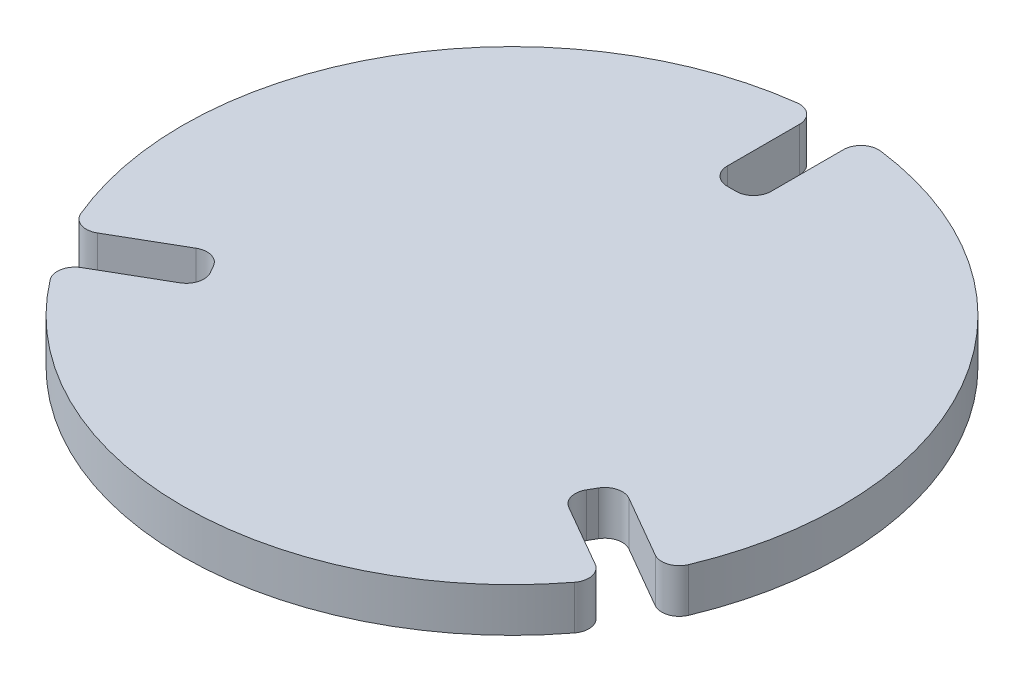
ISO-10303-21;
HEADER;
FILE_DESCRIPTION(('STEP AP214'),'2;1');
FILE_NAME('part.step','',(''),(''),'','','');
FILE_SCHEMA(('AUTOMOTIVE_DESIGN { 1 0 10303 214 1 1 1 1 }'));
ENDSEC;
DATA;
#1=APPLICATION_CONTEXT('core data for automotive mechanical design processes');
#2=APPLICATION_PROTOCOL_DEFINITION('international standard','automotive_design',2000,#1);
#3=PRODUCT_CONTEXT('',#1,'mechanical');
#4=PRODUCT('Part','Part','',(#3));
#5=PRODUCT_RELATED_PRODUCT_CATEGORY('part','',(#4));
#6=PRODUCT_DEFINITION_FORMATION('','',#4);
#7=PRODUCT_DEFINITION_CONTEXT('part definition',#1,'design');
#8=PRODUCT_DEFINITION('design','',#6,#7);
#9=PRODUCT_DEFINITION_SHAPE('','',#8);
#10=(LENGTH_UNIT() NAMED_UNIT(*) SI_UNIT(.MILLI.,.METRE.));
#11=(NAMED_UNIT(*) PLANE_ANGLE_UNIT() SI_UNIT($,.RADIAN.));
#12=(NAMED_UNIT(*) SI_UNIT($,.STERADIAN.) SOLID_ANGLE_UNIT());
#13=UNCERTAINTY_MEASURE_WITH_UNIT(LENGTH_MEASURE(1.E-05),#10,'distance_accuracy_value','');
#14=(GEOMETRIC_REPRESENTATION_CONTEXT(3) GLOBAL_UNCERTAINTY_ASSIGNED_CONTEXT((#13)) GLOBAL_UNIT_ASSIGNED_CONTEXT((#10,
#11,#12)) REPRESENTATION_CONTEXT('',''));
#15=CARTESIAN_POINT('',(0.,0.,0.));
#16=DIRECTION('',(0.,0.,1.));
#17=DIRECTION('',(1.,0.,0.));
#18=AXIS2_PLACEMENT_3D('',#15,#16,#17);
#19=CARTESIAN_POINT('',(1.25,-5.,2.1650635094611));
#20=DIRECTION('',(0.500000000000001,0.,0.866025403784438));
#21=DIRECTION('',(0.866025403784438,0.,-0.500000000000001));
#22=AXIS2_PLACEMENT_3D('',#19,#20,#21);
#23=PLANE('',#22);
#24=DIRECTION('',(0.866025403784438,0.,-0.500000000000001));
#25=VECTOR('',#24,1.);
#26=CARTESIAN_POINT('',(1.25,0.,2.1650635094611));
#27=LINE('',#26,#25);
#28=CARTESIAN_POINT('',(-29.2459013639538,0.,19.7718803711201));
#29=VERTEX_POINT('',#28);
#30=CARTESIAN_POINT('',(-22.1326859021798,0.,15.6650635094611));
#31=VERTEX_POINT('',#30);
#32=EDGE_CURVE('E353',#29,#31,#27,.T.);
#33=ORIENTED_EDGE('',*,*,#32,.T.);
#34=DIRECTION('',(0.,1.,0.));
#35=VECTOR('',#34,1.);
#36=CARTESIAN_POINT('',(-22.1326859021798,-5.,15.6650635094611));
#37=LINE('',#36,#35);
#38=CARTESIAN_POINT('',(-22.1326859021798,-5.,15.6650635094611));
#39=VERTEX_POINT('',#38);
#40=EDGE_CURVE('E297',#31,#39,#37,.F.);
#41=ORIENTED_EDGE('',*,*,#40,.T.);
#42=DIRECTION('',(0.866025403784438,0.,-0.500000000000001));
#43=VECTOR('',#42,1.);
#44=CARTESIAN_POINT('',(1.25,-5.,2.1650635094611));
#45=LINE('',#44,#43);
#46=CARTESIAN_POINT('',(-29.2459013639538,-5.,19.7718803711201));
#47=VERTEX_POINT('',#46);
#48=EDGE_CURVE('E335',#47,#39,#45,.T.);
#49=ORIENTED_EDGE('',*,*,#48,.F.);
#50=DIRECTION('',(0.,-1.,0.));
#51=VECTOR('',#50,1.);
#52=CARTESIAN_POINT('',(-29.2459013639538,0.,19.7718803711201));
#53=LINE('',#52,#51);
#54=EDGE_CURVE('E294',#47,#29,#53,.F.);
#55=ORIENTED_EDGE('',*,*,#54,.T.);
#56=EDGE_LOOP('',(#33,#41,#49,#55));
#57=FACE_BOUND('',#56,.T.);
#58=ADVANCED_FACE('F35',(#57),#23,.F.);
#59=CARTESIAN_POINT('',(-21.650635094611,-5.,12.5));
#60=DIRECTION('',(0.866025403784439,0.,-0.5));
#61=DIRECTION('',(-0.5,0.,-0.866025403784439));
#62=AXIS2_PLACEMENT_3D('',#59,#60,#61);
#63=PLANE('',#62);
#64=DIRECTION('',(-0.5,0.,-0.866025403784439));
#65=VECTOR('',#64,1.);
#66=CARTESIAN_POINT('',(-21.650635094611,-5.,12.5));
#67=LINE('',#66,#65);
#68=CARTESIAN_POINT('',(-21.400635094611,-5.,12.9330127018922));
#69=VERTEX_POINT('',#68);
#70=CARTESIAN_POINT('',(-21.900635094611,-5.,12.0669872981078));
#71=VERTEX_POINT('',#70);
#72=EDGE_CURVE('E223',#69,#71,#67,.T.);
#73=ORIENTED_EDGE('',*,*,#72,.F.);
#74=DIRECTION('',(0.,1.,0.));
#75=VECTOR('',#74,1.);
#76=CARTESIAN_POINT('',(-21.400635094611,0.,12.9330127018922));
#77=LINE('',#76,#75);
#78=CARTESIAN_POINT('',(-21.400635094611,0.,12.9330127018922));
#79=VERTEX_POINT('',#78);
#80=EDGE_CURVE('E291',#69,#79,#77,.T.);
#81=ORIENTED_EDGE('',*,*,#80,.T.);
#82=DIRECTION('',(-0.5,0.,-0.866025403784439));
#83=VECTOR('',#82,1.);
#84=CARTESIAN_POINT('',(-21.650635094611,0.,12.5));
#85=LINE('',#84,#83);
#86=CARTESIAN_POINT('',(-21.900635094611,0.,12.0669872981078));
#87=VERTEX_POINT('',#86);
#88=EDGE_CURVE('E231',#79,#87,#85,.T.);
#89=ORIENTED_EDGE('',*,*,#88,.T.);
#90=DIRECTION('',(0.,1.,0.));
#91=VECTOR('',#90,1.);
#92=CARTESIAN_POINT('',(-21.900635094611,-5.,12.0669872981078));
#93=LINE('',#92,#91);
#94=EDGE_CURVE('E289',#87,#71,#93,.F.);
#95=ORIENTED_EDGE('',*,*,#94,.T.);
#96=EDGE_LOOP('',(#73,#81,#89,#95));
#97=FACE_BOUND('',#96,.T.);
#98=ADVANCED_FACE('F333',(#97),#63,.F.);
#99=CARTESIAN_POINT('',(-1.25,-5.,-2.1650635094611));
#100=DIRECTION('',(0.5,0.,0.866025403784438));
#101=DIRECTION('',(0.866025403784438,0.,-0.5));
#102=AXIS2_PLACEMENT_3D('',#99,#100,#101);
#103=PLANE('',#102);
#104=DIRECTION('',(0.866025403784438,0.,-0.5));
#105=VECTOR('',#104,1.);
#106=CARTESIAN_POINT('',(-1.25,-5.,-2.1650635094611));
#107=LINE('',#106,#105);
#108=CARTESIAN_POINT('',(-31.7459013639538,-5.,15.4417533521979));
#109=VERTEX_POINT('',#108);
#110=CARTESIAN_POINT('',(-24.6326859021798,-5.,11.3349364905389));
#111=VERTEX_POINT('',#110);
#112=EDGE_CURVE('E228',#109,#111,#107,.T.);
#113=ORIENTED_EDGE('',*,*,#112,.T.);
#114=DIRECTION('',(0.,1.,0.));
#115=VECTOR('',#114,1.);
#116=CARTESIAN_POINT('',(-24.6326859021799,-5.,11.3349364905389));
#117=LINE('',#116,#115);
#118=CARTESIAN_POINT('',(-24.6326859021798,0.,11.3349364905389));
#119=VERTEX_POINT('',#118);
#120=EDGE_CURVE('E301',#111,#119,#117,.T.);
#121=ORIENTED_EDGE('',*,*,#120,.T.);
#122=DIRECTION('',(0.866025403784438,0.,-0.5));
#123=VECTOR('',#122,1.);
#124=CARTESIAN_POINT('',(-1.25,0.,-2.1650635094611));
#125=LINE('',#124,#123);
#126=CARTESIAN_POINT('',(-31.7459013639538,0.,15.4417533521979));
#127=VERTEX_POINT('',#126);
#128=EDGE_CURVE('E327',#127,#119,#125,.T.);
#129=ORIENTED_EDGE('',*,*,#128,.F.);
#130=DIRECTION('',(0.,1.,0.));
#131=VECTOR('',#130,1.);
#132=CARTESIAN_POINT('',(-31.7459013639538,-5.,15.4417533521979));
#133=LINE('',#132,#131);
#134=EDGE_CURVE('E299',#127,#109,#133,.F.);
#135=ORIENTED_EDGE('',*,*,#134,.T.);
#136=EDGE_LOOP('',(#113,#121,#129,#135));
#137=FACE_BOUND('',#136,.T.);
#138=ADVANCED_FACE('F344',(#137),#103,.T.);
#139=CARTESIAN_POINT('',(0.,-5.,0.));
#140=DIRECTION('',(0.,1.,0.));
#141=DIRECTION('',(0.,0.,1.));
#142=AXIS2_PLACEMENT_3D('',#139,#140,#141);
#143=CYLINDRICAL_SURFACE('',#142,37.5);
#144=CARTESIAN_POINT('',(0.,0.,0.));
#145=DIRECTION('',(0.,1.,0.));
#146=DIRECTION('',(0.,0.,1.));
#147=AXIS2_PLACEMENT_3D('',#144,#145,#146);
#148=CIRCLE('',#147,37.5);
#149=CARTESIAN_POINT('',(-4.75352112676057,0.,-37.1975004119557));
#150=VERTEX_POINT('',#149);
#151=CARTESIAN_POINT('',(-34.590740877416,0.,14.4820801527772));
#152=VERTEX_POINT('',#151);
#153=EDGE_CURVE('E374',#150,#152,#148,.T.);
#154=ORIENTED_EDGE('',*,*,#153,.F.);
#155=DIRECTION('',(0.,1.,0.));
#156=VECTOR('',#155,1.);
#157=CARTESIAN_POINT('',(-4.75352112676057,-5.,-37.1975004119557));
#158=LINE('',#157,#156);
#159=CARTESIAN_POINT('',(-4.75352112676057,-5.,-37.1975004119557));
#160=VERTEX_POINT('',#159);
#161=EDGE_CURVE('E264',#150,#160,#158,.F.);
#162=ORIENTED_EDGE('',*,*,#161,.T.);
#163=CARTESIAN_POINT('',(0.,-5.,0.));
#164=DIRECTION('',(0.,1.,0.));
#165=DIRECTION('',(0.,0.,1.));
#166=AXIS2_PLACEMENT_3D('',#163,#164,#165);
#167=CIRCLE('',#166,37.5);
#168=CARTESIAN_POINT('',(-34.590740877416,-5.,14.4820801527772));
#169=VERTEX_POINT('',#168);
#170=EDGE_CURVE('E346',#160,#169,#167,.T.);
#171=ORIENTED_EDGE('',*,*,#170,.T.);
#172=DIRECTION('',(0.,1.,0.));
#173=VECTOR('',#172,1.);
#174=CARTESIAN_POINT('',(-34.590740877416,-5.,14.4820801527772));
#175=LINE('',#174,#173);
#176=EDGE_CURVE('E261',#169,#152,#175,.T.);
#177=ORIENTED_EDGE('',*,*,#176,.T.);
#178=EDGE_LOOP('',(#154,#162,#171,#177));
#179=FACE_BOUND('',#178,.T.);
#180=ADVANCED_FACE('F380',(#179),#143,.T.);
#181=CARTESIAN_POINT('',(-2.5,-5.,0.));
#182=DIRECTION('',(-1.,0.,0.));
#183=DIRECTION('',(0.,0.,1.));
#184=AXIS2_PLACEMENT_3D('',#181,#182,#183);
#185=PLANE('',#184);
#186=DIRECTION('',(0.,0.,1.));
#187=VECTOR('',#186,1.);
#188=CARTESIAN_POINT('',(-2.5,-5.,0.));
#189=LINE('',#188,#187);
#190=CARTESIAN_POINT('',(-2.5,-5.,-35.213633723318));
#191=VERTEX_POINT('',#190);
#192=CARTESIAN_POINT('',(-2.5,-5.,-27.));
#193=VERTEX_POINT('',#192);
#194=EDGE_CURVE('E349',#191,#193,#189,.T.);
#195=ORIENTED_EDGE('',*,*,#194,.F.);
#196=DIRECTION('',(0.,-1.,0.));
#197=VECTOR('',#196,1.);
#198=CARTESIAN_POINT('',(-2.5,0.,-35.213633723318));
#199=LINE('',#198,#197);
#200=CARTESIAN_POINT('',(-2.5,0.,-35.213633723318));
#201=VERTEX_POINT('',#200);
#202=EDGE_CURVE('E258',#191,#201,#199,.F.);
#203=ORIENTED_EDGE('',*,*,#202,.T.);
#204=DIRECTION('',(0.,0.,1.));
#205=VECTOR('',#204,1.);
#206=CARTESIAN_POINT('',(-2.5,0.,0.));
#207=LINE('',#206,#205);
#208=CARTESIAN_POINT('',(-2.5,0.,-27.));
#209=VERTEX_POINT('',#208);
#210=EDGE_CURVE('E371',#201,#209,#207,.T.);
#211=ORIENTED_EDGE('',*,*,#210,.T.);
#212=DIRECTION('',(0.,1.,0.));
#213=VECTOR('',#212,1.);
#214=CARTESIAN_POINT('',(-2.5,-5.,-27.));
#215=LINE('',#214,#213);
#216=EDGE_CURVE('E256',#209,#193,#215,.F.);
#217=ORIENTED_EDGE('',*,*,#216,.T.);
#218=EDGE_LOOP('',(#195,#203,#211,#217));
#219=FACE_BOUND('',#218,.T.);
#220=ADVANCED_FACE('F391',(#219),#185,.F.);
#221=CARTESIAN_POINT('',(0.,-5.,-25.));
#222=DIRECTION('',(0.,0.,1.));
#223=DIRECTION('',(1.,0.,0.));
#224=AXIS2_PLACEMENT_3D('',#221,#222,#223);
#225=PLANE('',#224);
#226=DIRECTION('',(1.,0.,0.));
#227=VECTOR('',#226,1.);
#228=CARTESIAN_POINT('',(0.,-5.,-25.));
#229=LINE('',#228,#227);
#230=CARTESIAN_POINT('',(-0.5,-5.,-25.));
#231=VERTEX_POINT('',#230);
#232=CARTESIAN_POINT('',(0.5,-5.,-25.));
#233=VERTEX_POINT('',#232);
#234=EDGE_CURVE('E393',#231,#233,#229,.T.);
#235=ORIENTED_EDGE('',*,*,#234,.F.);
#236=DIRECTION('',(0.,1.,0.));
#237=VECTOR('',#236,1.);
#238=CARTESIAN_POINT('',(-0.5,0.,-25.));
#239=LINE('',#238,#237);
#240=CARTESIAN_POINT('',(-0.5,0.,-25.));
#241=VERTEX_POINT('',#240);
#242=EDGE_CURVE('E268',#231,#241,#239,.T.);
#243=ORIENTED_EDGE('',*,*,#242,.T.);
#244=DIRECTION('',(1.,0.,0.));
#245=VECTOR('',#244,1.);
#246=CARTESIAN_POINT('',(0.,0.,-25.));
#247=LINE('',#246,#245);
#248=CARTESIAN_POINT('',(0.5,0.,-25.));
#249=VERTEX_POINT('',#248);
#250=EDGE_CURVE('E368',#241,#249,#247,.T.);
#251=ORIENTED_EDGE('',*,*,#250,.T.);
#252=DIRECTION('',(0.,1.,0.));
#253=VECTOR('',#252,1.);
#254=CARTESIAN_POINT('',(0.5,-5.,-25.));
#255=LINE('',#254,#253);
#256=EDGE_CURVE('E266',#249,#233,#255,.F.);
#257=ORIENTED_EDGE('',*,*,#256,.T.);
#258=EDGE_LOOP('',(#235,#243,#251,#257));
#259=FACE_BOUND('',#258,.T.);
#260=ADVANCED_FACE('F465',(#259),#225,.F.);
#261=CARTESIAN_POINT('',(2.5,-5.,0.));
#262=DIRECTION('',(-1.,0.,0.));
#263=DIRECTION('',(0.,0.,1.));
#264=AXIS2_PLACEMENT_3D('',#261,#262,#263);
#265=PLANE('',#264);
#266=DIRECTION('',(0.,0.,1.));
#267=VECTOR('',#266,1.);
#268=CARTESIAN_POINT('',(2.5,0.,0.));
#269=LINE('',#268,#267);
#270=CARTESIAN_POINT('',(2.5,0.,-35.213633723318));
#271=VERTEX_POINT('',#270);
#272=CARTESIAN_POINT('',(2.5,0.,-27.));
#273=VERTEX_POINT('',#272);
#274=EDGE_CURVE('E218',#271,#273,#269,.T.);
#275=ORIENTED_EDGE('',*,*,#274,.F.);
#276=DIRECTION('',(0.,1.,0.));
#277=VECTOR('',#276,1.);
#278=CARTESIAN_POINT('',(2.5,-5.,-35.213633723318));
#279=LINE('',#278,#277);
#280=CARTESIAN_POINT('',(2.5,-5.,-35.213633723318));
#281=VERTEX_POINT('',#280);
#282=EDGE_CURVE('E244',#271,#281,#279,.F.);
#283=ORIENTED_EDGE('',*,*,#282,.T.);
#284=DIRECTION('',(0.,0.,1.));
#285=VECTOR('',#284,1.);
#286=CARTESIAN_POINT('',(2.5,-5.,0.));
#287=LINE('',#286,#285);
#288=CARTESIAN_POINT('',(2.5,-5.,-27.));
#289=VERTEX_POINT('',#288);
#290=EDGE_CURVE('E395',#281,#289,#287,.T.);
#291=ORIENTED_EDGE('',*,*,#290,.T.);
#292=DIRECTION('',(0.,1.,0.));
#293=VECTOR('',#292,1.);
#294=CARTESIAN_POINT('',(2.5,-5.,-27.));
#295=LINE('',#294,#293);
#296=EDGE_CURVE('E241',#289,#273,#295,.T.);
#297=ORIENTED_EDGE('',*,*,#296,.T.);
#298=EDGE_LOOP('',(#275,#283,#291,#297));
#299=FACE_BOUND('',#298,.T.);
#300=ADVANCED_FACE('F456',(#299),#265,.T.);
#301=CARTESIAN_POINT('',(0.,-5.,0.));
#302=DIRECTION('',(0.,1.,0.));
#303=DIRECTION('',(0.,0.,1.));
#304=AXIS2_PLACEMENT_3D('',#301,#302,#303);
#305=CYLINDRICAL_SURFACE('',#304,37.5);
#306=CARTESIAN_POINT('',(0.,-5.,0.));
#307=DIRECTION('',(0.,1.,0.));
#308=DIRECTION('',(0.,0.,1.));
#309=AXIS2_PLACEMENT_3D('',#306,#307,#308);
#310=CIRCLE('',#309,37.5);
#311=CARTESIAN_POINT('',(34.590740877416,-5.,14.4820801527771));
#312=VERTEX_POINT('',#311);
#313=CARTESIAN_POINT('',(4.75352112676057,-5.,-37.1975004119557));
#314=VERTEX_POINT('',#313);
#315=EDGE_CURVE('E400',#312,#314,#310,.T.);
#316=ORIENTED_EDGE('',*,*,#315,.T.);
#317=DIRECTION('',(0.,1.,0.));
#318=VECTOR('',#317,1.);
#319=CARTESIAN_POINT('',(4.75352112676057,-5.,-37.1975004119557));
#320=LINE('',#319,#318);
#321=CARTESIAN_POINT('',(4.75352112676057,0.,-37.1975004119557));
#322=VERTEX_POINT('',#321);
#323=EDGE_CURVE('E217',#314,#322,#320,.T.);
#324=ORIENTED_EDGE('',*,*,#323,.T.);
#325=CARTESIAN_POINT('',(0.,0.,0.));
#326=DIRECTION('',(0.,1.,0.));
#327=DIRECTION('',(0.,0.,1.));
#328=AXIS2_PLACEMENT_3D('',#325,#326,#327);
#329=CIRCLE('',#328,37.5);
#330=CARTESIAN_POINT('',(34.590740877416,0.,14.4820801527771));
#331=VERTEX_POINT('',#330);
#332=EDGE_CURVE('E200',#331,#322,#329,.T.);
#333=ORIENTED_EDGE('',*,*,#332,.F.);
#334=DIRECTION('',(0.,1.,0.));
#335=VECTOR('',#334,1.);
#336=CARTESIAN_POINT('',(34.590740877416,-5.,14.4820801527771));
#337=LINE('',#336,#335);
#338=EDGE_CURVE('E214',#331,#312,#337,.F.);
#339=ORIENTED_EDGE('',*,*,#338,.T.);
#340=EDGE_LOOP('',(#316,#324,#333,#339));
#341=FACE_BOUND('',#340,.T.);
#342=ADVANCED_FACE('F213',(#341),#305,.T.);
#343=CARTESIAN_POINT('',(1.25,-5.,-2.16506350946109));
#344=DIRECTION('',(0.5,0.,-0.866025403784439));
#345=DIRECTION('',(-0.866025403784439,0.,-0.5));
#346=AXIS2_PLACEMENT_3D('',#343,#344,#345);
#347=PLANE('',#346);
#348=DIRECTION('',(-0.866025403784439,0.,-0.5));
#349=VECTOR('',#348,1.);
#350=CARTESIAN_POINT('',(1.25,-5.,-2.16506350946109));
#351=LINE('',#350,#349);
#352=CARTESIAN_POINT('',(31.7459013639538,-5.,15.4417533521979));
#353=VERTEX_POINT('',#352);
#354=CARTESIAN_POINT('',(24.6326859021799,-5.,11.3349364905389));
#355=VERTEX_POINT('',#354);
#356=EDGE_CURVE('E402',#353,#355,#351,.T.);
#357=ORIENTED_EDGE('',*,*,#356,.F.);
#358=DIRECTION('',(0.,-1.,0.));
#359=VECTOR('',#358,1.);
#360=CARTESIAN_POINT('',(31.7459013639538,0.,15.4417533521979));
#361=LINE('',#360,#359);
#362=CARTESIAN_POINT('',(31.7459013639538,0.,15.4417533521979));
#363=VERTEX_POINT('',#362);
#364=EDGE_CURVE('E282',#353,#363,#361,.F.);
#365=ORIENTED_EDGE('',*,*,#364,.T.);
#366=DIRECTION('',(-0.866025403784439,0.,-0.5));
#367=VECTOR('',#366,1.);
#368=CARTESIAN_POINT('',(1.25,0.,-2.16506350946109));
#369=LINE('',#368,#367);
#370=CARTESIAN_POINT('',(24.6326859021799,0.,11.3349364905389));
#371=VERTEX_POINT('',#370);
#372=EDGE_CURVE('E202',#363,#371,#369,.T.);
#373=ORIENTED_EDGE('',*,*,#372,.T.);
#374=DIRECTION('',(0.,1.,0.));
#375=VECTOR('',#374,1.);
#376=CARTESIAN_POINT('',(24.6326859021799,-5.,11.3349364905389));
#377=LINE('',#376,#375);
#378=EDGE_CURVE('E280',#371,#355,#377,.F.);
#379=ORIENTED_EDGE('',*,*,#378,.T.);
#380=EDGE_LOOP('',(#357,#365,#373,#379));
#381=FACE_BOUND('',#380,.T.);
#382=ADVANCED_FACE('F449',(#381),#347,.F.);
#383=CARTESIAN_POINT('',(21.650635094611,-5.,12.5));
#384=DIRECTION('',(-0.866025403784438,0.,-0.500000000000001));
#385=DIRECTION('',(-0.500000000000001,0.,0.866025403784438));
#386=AXIS2_PLACEMENT_3D('',#383,#384,#385);
#387=PLANE('',#386);
#388=DIRECTION('',(-0.500000000000001,0.,0.866025403784438));
#389=VECTOR('',#388,1.);
#390=CARTESIAN_POINT('',(21.650635094611,-5.,12.5));
#391=LINE('',#390,#389);
#392=CARTESIAN_POINT('',(21.900635094611,-5.,12.0669872981078));
#393=VERTEX_POINT('',#392);
#394=CARTESIAN_POINT('',(21.400635094611,-5.,12.9330127018922));
#395=VERTEX_POINT('',#394);
#396=EDGE_CURVE('E405',#393,#395,#391,.T.);
#397=ORIENTED_EDGE('',*,*,#396,.F.);
#398=DIRECTION('',(0.,1.,0.));
#399=VECTOR('',#398,1.);
#400=CARTESIAN_POINT('',(21.900635094611,0.,12.0669872981078));
#401=LINE('',#400,#399);
#402=CARTESIAN_POINT('',(21.900635094611,0.,12.0669872981078));
#403=VERTEX_POINT('',#402);
#404=EDGE_CURVE('E286',#393,#403,#401,.T.);
#405=ORIENTED_EDGE('',*,*,#404,.T.);
#406=DIRECTION('',(-0.500000000000001,0.,0.866025403784438));
#407=VECTOR('',#406,1.);
#408=CARTESIAN_POINT('',(21.650635094611,0.,12.5));
#409=LINE('',#408,#407);
#410=CARTESIAN_POINT('',(21.400635094611,0.,12.9330127018922));
#411=VERTEX_POINT('',#410);
#412=EDGE_CURVE('E362',#403,#411,#409,.T.);
#413=ORIENTED_EDGE('',*,*,#412,.T.);
#414=DIRECTION('',(0.,1.,0.));
#415=VECTOR('',#414,1.);
#416=CARTESIAN_POINT('',(21.400635094611,-5.,12.9330127018922));
#417=LINE('',#416,#415);
#418=EDGE_CURVE('E284',#411,#395,#417,.F.);
#419=ORIENTED_EDGE('',*,*,#418,.T.);
#420=EDGE_LOOP('',(#397,#405,#413,#419));
#421=FACE_BOUND('',#420,.T.);
#422=ADVANCED_FACE('F441',(#421),#387,.F.);
#423=CARTESIAN_POINT('',(-1.24999999999999,-5.,2.16506350946107));
#424=DIRECTION('',(0.500000000000001,0.,-0.866025403784438));
#425=DIRECTION('',(-0.866025403784438,0.,-0.500000000000001));
#426=AXIS2_PLACEMENT_3D('',#423,#424,#425);
#427=PLANE('',#426);
#428=DIRECTION('',(-0.866025403784438,0.,-0.500000000000001));
#429=VECTOR('',#428,1.);
#430=CARTESIAN_POINT('',(-1.24999999999999,0.,2.16506350946107));
#431=LINE('',#430,#429);
#432=CARTESIAN_POINT('',(29.2459013639538,0.,19.7718803711201));
#433=VERTEX_POINT('',#432);
#434=CARTESIAN_POINT('',(22.1326859021799,0.,15.6650635094611));
#435=VERTEX_POINT('',#434);
#436=EDGE_CURVE('E359',#433,#435,#431,.T.);
#437=ORIENTED_EDGE('',*,*,#436,.F.);
#438=DIRECTION('',(0.,1.,0.));
#439=VECTOR('',#438,1.);
#440=CARTESIAN_POINT('',(29.2459013639538,-5.,19.7718803711201));
#441=LINE('',#440,#439);
#442=CARTESIAN_POINT('',(29.2459013639538,-5.,19.7718803711201));
#443=VERTEX_POINT('',#442);
#444=EDGE_CURVE('E278',#433,#443,#441,.F.);
#445=ORIENTED_EDGE('',*,*,#444,.T.);
#446=DIRECTION('',(-0.866025403784438,0.,-0.500000000000001));
#447=VECTOR('',#446,1.);
#448=CARTESIAN_POINT('',(-1.24999999999999,-5.,2.16506350946107));
#449=LINE('',#448,#447);
#450=CARTESIAN_POINT('',(22.1326859021799,-5.,15.6650635094611));
#451=VERTEX_POINT('',#450);
#452=EDGE_CURVE('E408',#443,#451,#449,.T.);
#453=ORIENTED_EDGE('',*,*,#452,.T.);
#454=DIRECTION('',(0.,1.,0.));
#455=VECTOR('',#454,1.);
#456=CARTESIAN_POINT('',(22.1326859021799,-5.,15.6650635094611));
#457=LINE('',#456,#455);
#458=EDGE_CURVE('E275',#451,#435,#457,.T.);
#459=ORIENTED_EDGE('',*,*,#458,.T.);
#460=EDGE_LOOP('',(#437,#445,#453,#459));
#461=FACE_BOUND('',#460,.T.);
#462=ADVANCED_FACE('F432',(#461),#427,.T.);
#463=CARTESIAN_POINT('',(0.,-5.,0.));
#464=DIRECTION('',(0.,1.,0.));
#465=DIRECTION('',(0.,0.,1.));
#466=AXIS2_PLACEMENT_3D('',#463,#464,#465);
#467=CYLINDRICAL_SURFACE('',#466,37.5);
#468=CARTESIAN_POINT('',(0.,-5.,0.));
#469=DIRECTION('',(0.,1.,0.));
#470=DIRECTION('',(0.,0.,1.));
#471=AXIS2_PLACEMENT_3D('',#468,#469,#470);
#472=CIRCLE('',#471,37.5);
#473=CARTESIAN_POINT('',(-29.8372197506554,-5.,22.7154202591785));
#474=VERTEX_POINT('',#473);
#475=CARTESIAN_POINT('',(29.8372197506554,-5.,22.7154202591785));
#476=VERTEX_POINT('',#475);
#477=EDGE_CURVE('E411',#474,#476,#472,.T.);
#478=ORIENTED_EDGE('',*,*,#477,.T.);
#479=DIRECTION('',(0.,1.,0.));
#480=VECTOR('',#479,1.);
#481=CARTESIAN_POINT('',(29.8372197506554,-5.,22.7154202591785));
#482=LINE('',#481,#480);
#483=CARTESIAN_POINT('',(29.8372197506554,0.,22.7154202591785));
#484=VERTEX_POINT('',#483);
#485=EDGE_CURVE('E272',#476,#484,#482,.T.);
#486=ORIENTED_EDGE('',*,*,#485,.T.);
#487=CARTESIAN_POINT('',(0.,0.,0.));
#488=DIRECTION('',(0.,1.,0.));
#489=DIRECTION('',(0.,0.,1.));
#490=AXIS2_PLACEMENT_3D('',#487,#488,#489);
#491=CIRCLE('',#490,37.5);
#492=CARTESIAN_POINT('',(-29.8372197506554,0.,22.7154202591785));
#493=VERTEX_POINT('',#492);
#494=EDGE_CURVE('E356',#493,#484,#491,.T.);
#495=ORIENTED_EDGE('',*,*,#494,.F.);
#496=DIRECTION('',(0.,1.,0.));
#497=VECTOR('',#496,1.);
#498=CARTESIAN_POINT('',(-29.8372197506554,-5.,22.7154202591785));
#499=LINE('',#498,#497);
#500=EDGE_CURVE('E57',#493,#474,#499,.F.);
#501=ORIENTED_EDGE('',*,*,#500,.T.);
#502=EDGE_LOOP('',(#478,#486,#495,#501));
#503=FACE_BOUND('',#502,.T.);
#504=ADVANCED_FACE('F425',(#503),#467,.T.);
#505=CARTESIAN_POINT('',(0.,-5.,0.));
#506=DIRECTION('',(0.,1.,0.));
#507=DIRECTION('',(0.,0.,1.));
#508=AXIS2_PLACEMENT_3D('',#505,#506,#507);
#509=PLANE('',#508);
#510=ORIENTED_EDGE('',*,*,#290,.F.);
#511=CARTESIAN_POINT('',(4.5,-5.,-35.213633723318));
#512=DIRECTION('',(0.,1.,0.));
#513=DIRECTION('',(0.,0.,1.));
#514=AXIS2_PLACEMENT_3D('',#511,#512,#513);
#515=CIRCLE('',#514,2.);
#516=EDGE_CURVE('E254',#281,#314,#515,.F.);
#517=ORIENTED_EDGE('',*,*,#516,.T.);
#518=ORIENTED_EDGE('',*,*,#315,.F.);
#519=CARTESIAN_POINT('',(32.7459013639538,-5.,13.709702544629));
#520=DIRECTION('',(0.,1.,0.));
#521=DIRECTION('',(0.,0.,1.));
#522=AXIS2_PLACEMENT_3D('',#519,#520,#521);
#523=CIRCLE('',#522,2.);
#524=EDGE_CURVE('E222',#312,#353,#523,.F.);
#525=ORIENTED_EDGE('',*,*,#524,.T.);
#526=ORIENTED_EDGE('',*,*,#356,.T.);
#527=CARTESIAN_POINT('',(23.6326859021799,-5.,13.0669872981078));
#528=DIRECTION('',(0.,1.,0.));
#529=DIRECTION('',(0.,0.,1.));
#530=AXIS2_PLACEMENT_3D('',#527,#528,#529);
#531=CIRCLE('',#530,2.);
#532=EDGE_CURVE('E314',#355,#393,#531,.T.);
#533=ORIENTED_EDGE('',*,*,#532,.T.);
#534=ORIENTED_EDGE('',*,*,#396,.T.);
#535=CARTESIAN_POINT('',(23.1326859021799,-5.,13.9330127018922));
#536=DIRECTION('',(0.,1.,0.));
#537=DIRECTION('',(0.,0.,1.));
#538=AXIS2_PLACEMENT_3D('',#535,#536,#537);
#539=CIRCLE('',#538,2.);
#540=EDGE_CURVE('E318',#395,#451,#539,.T.);
#541=ORIENTED_EDGE('',*,*,#540,.T.);
#542=ORIENTED_EDGE('',*,*,#452,.F.);
#543=CARTESIAN_POINT('',(28.2459013639538,-5.,21.503931178689));
#544=DIRECTION('',(0.,1.,0.));
#545=DIRECTION('',(0.,0.,1.));
#546=AXIS2_PLACEMENT_3D('',#543,#544,#545);
#547=CIRCLE('',#546,2.);
#548=EDGE_CURVE('E50',#443,#476,#547,.F.);
#549=ORIENTED_EDGE('',*,*,#548,.T.);
#550=ORIENTED_EDGE('',*,*,#477,.F.);
#551=CARTESIAN_POINT('',(-28.2459013639538,-5.,21.503931178689));
#552=DIRECTION('',(0.,1.,0.));
#553=DIRECTION('',(0.,0.,1.));
#554=AXIS2_PLACEMENT_3D('',#551,#552,#553);
#555=CIRCLE('',#554,2.);
#556=EDGE_CURVE('E248',#474,#47,#555,.F.);
#557=ORIENTED_EDGE('',*,*,#556,.T.);
#558=ORIENTED_EDGE('',*,*,#48,.T.);
#559=CARTESIAN_POINT('',(-23.1326859021798,-5.,13.9330127018922));
#560=DIRECTION('',(0.,1.,0.));
#561=DIRECTION('',(0.,0.,1.));
#562=AXIS2_PLACEMENT_3D('',#559,#560,#561);
#563=CIRCLE('',#562,2.);
#564=EDGE_CURVE('E322',#39,#69,#563,.T.);
#565=ORIENTED_EDGE('',*,*,#564,.T.);
#566=ORIENTED_EDGE('',*,*,#72,.T.);
#567=CARTESIAN_POINT('',(-23.6326859021798,-5.,13.0669872981078));
#568=DIRECTION('',(0.,1.,0.));
#569=DIRECTION('',(0.,0.,1.));
#570=AXIS2_PLACEMENT_3D('',#567,#568,#569);
#571=CIRCLE('',#570,2.);
#572=EDGE_CURVE('E11',#71,#111,#571,.T.);
#573=ORIENTED_EDGE('',*,*,#572,.T.);
#574=ORIENTED_EDGE('',*,*,#112,.F.);
#575=CARTESIAN_POINT('',(-32.7459013639538,-5.,13.7097025446291));
#576=DIRECTION('',(0.,1.,0.));
#577=DIRECTION('',(0.,0.,1.));
#578=AXIS2_PLACEMENT_3D('',#575,#576,#577);
#579=CIRCLE('',#578,2.);
#580=EDGE_CURVE('E246',#109,#169,#579,.F.);
#581=ORIENTED_EDGE('',*,*,#580,.T.);
#582=ORIENTED_EDGE('',*,*,#170,.F.);
#583=CARTESIAN_POINT('',(-4.5,-5.,-35.213633723318));
#584=DIRECTION('',(0.,1.,0.));
#585=DIRECTION('',(0.,0.,1.));
#586=AXIS2_PLACEMENT_3D('',#583,#584,#585);
#587=CIRCLE('',#586,2.);
#588=EDGE_CURVE('E252',#160,#191,#587,.F.);
#589=ORIENTED_EDGE('',*,*,#588,.T.);
#590=ORIENTED_EDGE('',*,*,#194,.T.);
#591=CARTESIAN_POINT('',(-0.5,-5.,-27.));
#592=DIRECTION('',(0.,1.,0.));
#593=DIRECTION('',(0.,0.,1.));
#594=AXIS2_PLACEMENT_3D('',#591,#592,#593);
#595=CIRCLE('',#594,2.);
#596=EDGE_CURVE('E306',#193,#231,#595,.T.);
#597=ORIENTED_EDGE('',*,*,#596,.T.);
#598=ORIENTED_EDGE('',*,*,#234,.T.);
#599=CARTESIAN_POINT('',(0.5,-5.,-27.));
#600=DIRECTION('',(0.,1.,0.));
#601=DIRECTION('',(0.,0.,1.));
#602=AXIS2_PLACEMENT_3D('',#599,#600,#601);
#603=CIRCLE('',#602,2.);
#604=EDGE_CURVE('E310',#233,#289,#603,.T.);
#605=ORIENTED_EDGE('',*,*,#604,.T.);
#606=EDGE_LOOP('',(#510,#517,#518,#525,#526,#533,#534,#541,#542,#549,#550,#557,#558,#565,#566,
#573,#574,#581,#582,#589,#590,#597,#598,#605));
#607=FACE_BOUND('',#606,.T.);
#608=ADVANCED_FACE('F341',(#607),#509,.F.);
#609=CARTESIAN_POINT('',(0.,0.,0.));
#610=DIRECTION('',(0.,1.,0.));
#611=DIRECTION('',(0.,0.,1.));
#612=AXIS2_PLACEMENT_3D('',#609,#610,#611);
#613=PLANE('',#612);
#614=ORIENTED_EDGE('',*,*,#332,.T.);
#615=CARTESIAN_POINT('',(4.5,0.,-35.213633723318));
#616=DIRECTION('',(0.,1.,0.));
#617=DIRECTION('',(0.,0.,1.));
#618=AXIS2_PLACEMENT_3D('',#615,#616,#617);
#619=CIRCLE('',#618,2.);
#620=EDGE_CURVE('E239',#322,#271,#619,.T.);
#621=ORIENTED_EDGE('',*,*,#620,.T.);
#622=ORIENTED_EDGE('',*,*,#274,.T.);
#623=CARTESIAN_POINT('',(0.5,0.,-27.));
#624=DIRECTION('',(0.,1.,0.));
#625=DIRECTION('',(0.,0.,1.));
#626=AXIS2_PLACEMENT_3D('',#623,#624,#625);
#627=CIRCLE('',#626,2.);
#628=EDGE_CURVE('E308',#273,#249,#627,.F.);
#629=ORIENTED_EDGE('',*,*,#628,.T.);
#630=ORIENTED_EDGE('',*,*,#250,.F.);
#631=CARTESIAN_POINT('',(-0.5,0.,-27.));
#632=DIRECTION('',(0.,1.,0.));
#633=DIRECTION('',(0.,0.,1.));
#634=AXIS2_PLACEMENT_3D('',#631,#632,#633);
#635=CIRCLE('',#634,2.);
#636=EDGE_CURVE('E304',#241,#209,#635,.F.);
#637=ORIENTED_EDGE('',*,*,#636,.T.);
#638=ORIENTED_EDGE('',*,*,#210,.F.);
#639=CARTESIAN_POINT('',(-4.5,0.,-35.213633723318));
#640=DIRECTION('',(0.,1.,0.));
#641=DIRECTION('',(0.,0.,1.));
#642=AXIS2_PLACEMENT_3D('',#639,#640,#641);
#643=CIRCLE('',#642,2.);
#644=EDGE_CURVE('E237',#201,#150,#643,.T.);
#645=ORIENTED_EDGE('',*,*,#644,.T.);
#646=ORIENTED_EDGE('',*,*,#153,.T.);
#647=CARTESIAN_POINT('',(-32.7459013639538,0.,13.7097025446291));
#648=DIRECTION('',(0.,1.,0.));
#649=DIRECTION('',(0.,0.,1.));
#650=AXIS2_PLACEMENT_3D('',#647,#648,#649);
#651=CIRCLE('',#650,2.);
#652=EDGE_CURVE('E225',#152,#127,#651,.T.);
#653=ORIENTED_EDGE('',*,*,#652,.T.);
#654=ORIENTED_EDGE('',*,*,#128,.T.);
#655=CARTESIAN_POINT('',(-23.6326859021798,0.,13.0669872981078));
#656=DIRECTION('',(0.,1.,0.));
#657=DIRECTION('',(0.,0.,1.));
#658=AXIS2_PLACEMENT_3D('',#655,#656,#657);
#659=CIRCLE('',#658,2.);
#660=EDGE_CURVE('E43',#119,#87,#659,.F.);
#661=ORIENTED_EDGE('',*,*,#660,.T.);
#662=ORIENTED_EDGE('',*,*,#88,.F.);
#663=CARTESIAN_POINT('',(-23.1326859021798,0.,13.9330127018922));
#664=DIRECTION('',(0.,1.,0.));
#665=DIRECTION('',(0.,0.,1.));
#666=AXIS2_PLACEMENT_3D('',#663,#664,#665);
#667=CIRCLE('',#666,2.);
#668=EDGE_CURVE('E320',#79,#31,#667,.F.);
#669=ORIENTED_EDGE('',*,*,#668,.T.);
#670=ORIENTED_EDGE('',*,*,#32,.F.);
#671=CARTESIAN_POINT('',(-28.2459013639538,0.,21.503931178689));
#672=DIRECTION('',(0.,1.,0.));
#673=DIRECTION('',(0.,0.,1.));
#674=AXIS2_PLACEMENT_3D('',#671,#672,#673);
#675=CIRCLE('',#674,2.);
#676=EDGE_CURVE('E208',#29,#493,#675,.T.);
#677=ORIENTED_EDGE('',*,*,#676,.T.);
#678=ORIENTED_EDGE('',*,*,#494,.T.);
#679=CARTESIAN_POINT('',(28.2459013639538,0.,21.503931178689));
#680=DIRECTION('',(0.,1.,0.));
#681=DIRECTION('',(0.,0.,1.));
#682=AXIS2_PLACEMENT_3D('',#679,#680,#681);
#683=CIRCLE('',#682,2.);
#684=EDGE_CURVE('E207',#484,#433,#683,.T.);
#685=ORIENTED_EDGE('',*,*,#684,.T.);
#686=ORIENTED_EDGE('',*,*,#436,.T.);
#687=CARTESIAN_POINT('',(23.1326859021799,0.,13.9330127018922));
#688=DIRECTION('',(0.,1.,0.));
#689=DIRECTION('',(0.,0.,1.));
#690=AXIS2_PLACEMENT_3D('',#687,#688,#689);
#691=CIRCLE('',#690,2.);
#692=EDGE_CURVE('E316',#435,#411,#691,.F.);
#693=ORIENTED_EDGE('',*,*,#692,.T.);
#694=ORIENTED_EDGE('',*,*,#412,.F.);
#695=CARTESIAN_POINT('',(23.6326859021799,0.,13.0669872981078));
#696=DIRECTION('',(0.,1.,0.));
#697=DIRECTION('',(0.,0.,1.));
#698=AXIS2_PLACEMENT_3D('',#695,#696,#697);
#699=CIRCLE('',#698,2.);
#700=EDGE_CURVE('E312',#403,#371,#699,.F.);
#701=ORIENTED_EDGE('',*,*,#700,.T.);
#702=ORIENTED_EDGE('',*,*,#372,.F.);
#703=CARTESIAN_POINT('',(32.7459013639538,0.,13.709702544629));
#704=DIRECTION('',(0.,1.,0.));
#705=DIRECTION('',(0.,0.,1.));
#706=AXIS2_PLACEMENT_3D('',#703,#704,#705);
#707=CIRCLE('',#706,2.);
#708=EDGE_CURVE('E197',#363,#331,#707,.T.);
#709=ORIENTED_EDGE('',*,*,#708,.T.);
#710=EDGE_LOOP('',(#614,#621,#622,#629,#630,#637,#638,#645,#646,#653,#654,#661,#662,#669,#670,
#677,#678,#685,#686,#693,#694,#701,#702,#709));
#711=FACE_BOUND('',#710,.T.);
#712=ADVANCED_FACE('F199',(#711),#613,.T.);
#713=CARTESIAN_POINT('',(4.5,-5.,-35.213633723318));
#714=DIRECTION('',(0.,1.,0.));
#715=DIRECTION('',(0.,0.,1.));
#716=AXIS2_PLACEMENT_3D('',#713,#714,#715);
#717=CYLINDRICAL_SURFACE('',#716,2.);
#718=ORIENTED_EDGE('',*,*,#516,.F.);
#719=ORIENTED_EDGE('',*,*,#282,.F.);
#720=ORIENTED_EDGE('',*,*,#620,.F.);
#721=ORIENTED_EDGE('',*,*,#323,.F.);
#722=EDGE_LOOP('',(#718,#719,#720,#721));
#723=FACE_BOUND('',#722,.T.);
#724=ADVANCED_FACE('F452',(#723),#717,.T.);
#725=CARTESIAN_POINT('',(-4.5,-5.,-35.213633723318));
#726=DIRECTION('',(0.,1.,0.));
#727=DIRECTION('',(0.,0.,1.));
#728=AXIS2_PLACEMENT_3D('',#725,#726,#727);
#729=CYLINDRICAL_SURFACE('',#728,2.);
#730=ORIENTED_EDGE('',*,*,#588,.F.);
#731=ORIENTED_EDGE('',*,*,#161,.F.);
#732=ORIENTED_EDGE('',*,*,#644,.F.);
#733=ORIENTED_EDGE('',*,*,#202,.F.);
#734=EDGE_LOOP('',(#730,#731,#732,#733));
#735=FACE_BOUND('',#734,.T.);
#736=ADVANCED_FACE('F385',(#735),#729,.T.);
#737=CARTESIAN_POINT('',(-0.5,-5.,-27.));
#738=DIRECTION('',(0.,-1.,0.));
#739=DIRECTION('',(0.,0.,-1.));
#740=AXIS2_PLACEMENT_3D('',#737,#738,#739);
#741=CYLINDRICAL_SURFACE('',#740,2.);
#742=ORIENTED_EDGE('',*,*,#596,.F.);
#743=ORIENTED_EDGE('',*,*,#216,.F.);
#744=ORIENTED_EDGE('',*,*,#636,.F.);
#745=ORIENTED_EDGE('',*,*,#242,.F.);
#746=EDGE_LOOP('',(#742,#743,#744,#745));
#747=FACE_BOUND('',#746,.T.);
#748=ADVANCED_FACE('F468',(#747),#741,.F.);
#749=CARTESIAN_POINT('',(0.5,-5.,-27.));
#750=DIRECTION('',(0.,1.,0.));
#751=DIRECTION('',(0.,0.,1.));
#752=AXIS2_PLACEMENT_3D('',#749,#750,#751);
#753=CYLINDRICAL_SURFACE('',#752,2.);
#754=ORIENTED_EDGE('',*,*,#604,.F.);
#755=ORIENTED_EDGE('',*,*,#256,.F.);
#756=ORIENTED_EDGE('',*,*,#628,.F.);
#757=ORIENTED_EDGE('',*,*,#296,.F.);
#758=EDGE_LOOP('',(#754,#755,#756,#757));
#759=FACE_BOUND('',#758,.T.);
#760=ADVANCED_FACE('F460',(#759),#753,.F.);
#761=CARTESIAN_POINT('',(28.2459013639538,-5.,21.503931178689));
#762=DIRECTION('',(0.,1.,0.));
#763=DIRECTION('',(0.,0.,1.));
#764=AXIS2_PLACEMENT_3D('',#761,#762,#763);
#765=CYLINDRICAL_SURFACE('',#764,2.);
#766=ORIENTED_EDGE('',*,*,#548,.F.);
#767=ORIENTED_EDGE('',*,*,#444,.F.);
#768=ORIENTED_EDGE('',*,*,#684,.F.);
#769=ORIENTED_EDGE('',*,*,#485,.F.);
#770=EDGE_LOOP('',(#766,#767,#768,#769));
#771=FACE_BOUND('',#770,.T.);
#772=ADVANCED_FACE('F428',(#771),#765,.T.);
#773=CARTESIAN_POINT('',(32.7459013639538,-5.,13.709702544629));
#774=DIRECTION('',(0.,1.,0.));
#775=DIRECTION('',(0.,0.,1.));
#776=AXIS2_PLACEMENT_3D('',#773,#774,#775);
#777=CYLINDRICAL_SURFACE('',#776,2.);
#778=ORIENTED_EDGE('',*,*,#524,.F.);
#779=ORIENTED_EDGE('',*,*,#338,.F.);
#780=ORIENTED_EDGE('',*,*,#708,.F.);
#781=ORIENTED_EDGE('',*,*,#364,.F.);
#782=EDGE_LOOP('',(#778,#779,#780,#781));
#783=FACE_BOUND('',#782,.T.);
#784=ADVANCED_FACE('F221',(#783),#777,.T.);
#785=CARTESIAN_POINT('',(23.6326859021799,-5.,13.0669872981078));
#786=DIRECTION('',(0.,-1.,0.));
#787=DIRECTION('',(0.,0.,-1.));
#788=AXIS2_PLACEMENT_3D('',#785,#786,#787);
#789=CYLINDRICAL_SURFACE('',#788,2.);
#790=ORIENTED_EDGE('',*,*,#532,.F.);
#791=ORIENTED_EDGE('',*,*,#378,.F.);
#792=ORIENTED_EDGE('',*,*,#700,.F.);
#793=ORIENTED_EDGE('',*,*,#404,.F.);
#794=EDGE_LOOP('',(#790,#791,#792,#793));
#795=FACE_BOUND('',#794,.T.);
#796=ADVANCED_FACE('F445',(#795),#789,.F.);
#797=CARTESIAN_POINT('',(23.1326859021799,-5.,13.9330127018922));
#798=DIRECTION('',(0.,1.,0.));
#799=DIRECTION('',(0.,0.,1.));
#800=AXIS2_PLACEMENT_3D('',#797,#798,#799);
#801=CYLINDRICAL_SURFACE('',#800,2.);
#802=ORIENTED_EDGE('',*,*,#540,.F.);
#803=ORIENTED_EDGE('',*,*,#418,.F.);
#804=ORIENTED_EDGE('',*,*,#692,.F.);
#805=ORIENTED_EDGE('',*,*,#458,.F.);
#806=EDGE_LOOP('',(#802,#803,#804,#805));
#807=FACE_BOUND('',#806,.T.);
#808=ADVANCED_FACE('F436',(#807),#801,.F.);
#809=CARTESIAN_POINT('',(-23.1326859021798,-5.,13.9330127018922));
#810=DIRECTION('',(0.,-1.,0.));
#811=DIRECTION('',(0.,0.,-1.));
#812=AXIS2_PLACEMENT_3D('',#809,#810,#811);
#813=CYLINDRICAL_SURFACE('',#812,2.);
#814=ORIENTED_EDGE('',*,*,#564,.F.);
#815=ORIENTED_EDGE('',*,*,#40,.F.);
#816=ORIENTED_EDGE('',*,*,#668,.F.);
#817=ORIENTED_EDGE('',*,*,#80,.F.);
#818=EDGE_LOOP('',(#814,#815,#816,#817));
#819=FACE_BOUND('',#818,.T.);
#820=ADVANCED_FACE('F421',(#819),#813,.F.);
#821=CARTESIAN_POINT('',(-23.6326859021798,-5.,13.0669872981078));
#822=DIRECTION('',(0.,1.,0.));
#823=DIRECTION('',(0.,0.,1.));
#824=AXIS2_PLACEMENT_3D('',#821,#822,#823);
#825=CYLINDRICAL_SURFACE('',#824,2.);
#826=ORIENTED_EDGE('',*,*,#572,.F.);
#827=ORIENTED_EDGE('',*,*,#94,.F.);
#828=ORIENTED_EDGE('',*,*,#660,.F.);
#829=ORIENTED_EDGE('',*,*,#120,.F.);
#830=EDGE_LOOP('',(#826,#827,#828,#829));
#831=FACE_BOUND('',#830,.T.);
#832=ADVANCED_FACE('F337',(#831),#825,.F.);
#833=CARTESIAN_POINT('',(-28.2459013639538,-5.,21.503931178689));
#834=DIRECTION('',(0.,1.,0.));
#835=DIRECTION('',(0.,0.,1.));
#836=AXIS2_PLACEMENT_3D('',#833,#834,#835);
#837=CYLINDRICAL_SURFACE('',#836,2.);
#838=ORIENTED_EDGE('',*,*,#556,.F.);
#839=ORIENTED_EDGE('',*,*,#500,.F.);
#840=ORIENTED_EDGE('',*,*,#676,.F.);
#841=ORIENTED_EDGE('',*,*,#54,.F.);
#842=EDGE_LOOP('',(#838,#839,#840,#841));
#843=FACE_BOUND('',#842,.T.);
#844=ADVANCED_FACE('F424',(#843),#837,.T.);
#845=CARTESIAN_POINT('',(-32.7459013639538,-5.,13.7097025446291));
#846=DIRECTION('',(0.,1.,0.));
#847=DIRECTION('',(0.,0.,1.));
#848=AXIS2_PLACEMENT_3D('',#845,#846,#847);
#849=CYLINDRICAL_SURFACE('',#848,2.);
#850=ORIENTED_EDGE('',*,*,#580,.F.);
#851=ORIENTED_EDGE('',*,*,#134,.F.);
#852=ORIENTED_EDGE('',*,*,#652,.F.);
#853=ORIENTED_EDGE('',*,*,#176,.F.);
#854=EDGE_LOOP('',(#850,#851,#852,#853));
#855=FACE_BOUND('',#854,.T.);
#856=ADVANCED_FACE('F37',(#855),#849,.T.);
#857=CLOSED_SHELL('',(#58,#98,#138,#180,#220,#260,#300,#342,#382,#422,#462,#504,#608,#712,#724,
#736,#748,#760,#772,#784,#796,#808,#820,#832,#844,#856));
#858=MANIFOLD_SOLID_BREP('B2',#857);
#859=ADVANCED_BREP_SHAPE_REPRESENTATION('',(#18,#858),#14);
#860=SHAPE_DEFINITION_REPRESENTATION(#9,#859);
ENDSEC;
END-ISO-10303-21;
